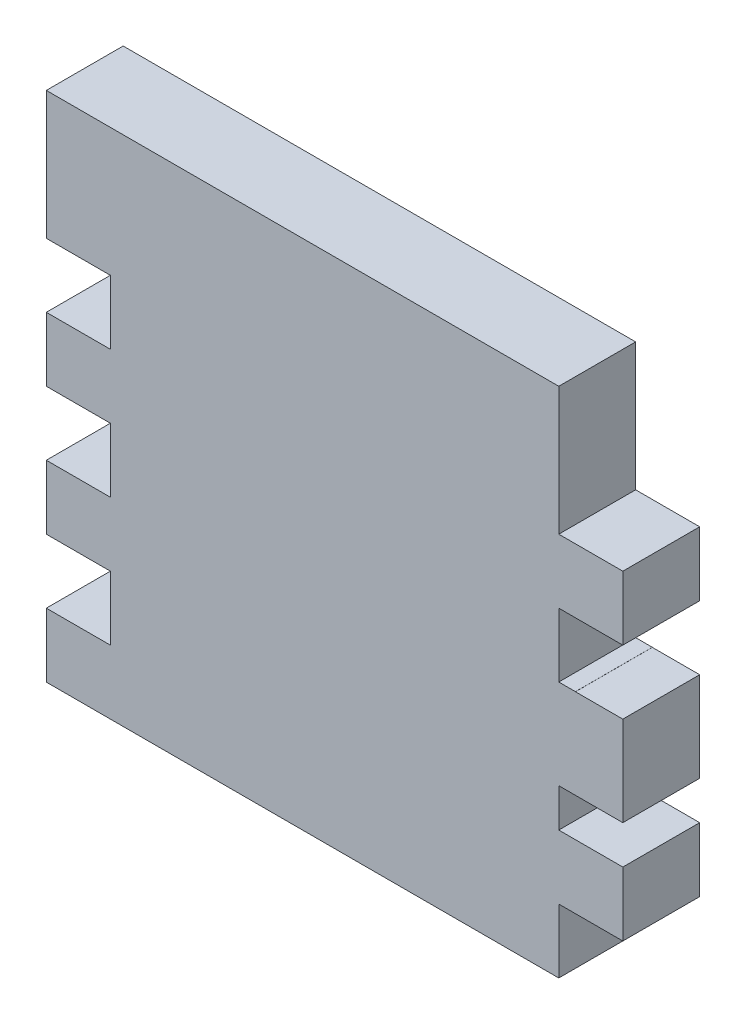
ISO-10303-21;
HEADER;
FILE_DESCRIPTION(('STEP AP214'),'2;1');
FILE_NAME('part.step','',(''),(''),'','','');
FILE_SCHEMA(('AUTOMOTIVE_DESIGN { 1 0 10303 214 1 1 1 1 }'));
ENDSEC;
DATA;
#1=APPLICATION_CONTEXT('core data for automotive mechanical design processes');
#2=APPLICATION_PROTOCOL_DEFINITION('international standard','automotive_design',2000,#1);
#3=PRODUCT_CONTEXT('',#1,'mechanical');
#4=PRODUCT('Part','Part','',(#3));
#5=PRODUCT_RELATED_PRODUCT_CATEGORY('part','',(#4));
#6=PRODUCT_DEFINITION_FORMATION('','',#4);
#7=PRODUCT_DEFINITION_CONTEXT('part definition',#1,'design');
#8=PRODUCT_DEFINITION('design','',#6,#7);
#9=PRODUCT_DEFINITION_SHAPE('','',#8);
#10=(LENGTH_UNIT() NAMED_UNIT(*) SI_UNIT(.MILLI.,.METRE.));
#11=(NAMED_UNIT(*) PLANE_ANGLE_UNIT() SI_UNIT($,.RADIAN.));
#12=(NAMED_UNIT(*) SI_UNIT($,.STERADIAN.) SOLID_ANGLE_UNIT());
#13=UNCERTAINTY_MEASURE_WITH_UNIT(LENGTH_MEASURE(1.E-05),#10,'distance_accuracy_value','');
#14=(GEOMETRIC_REPRESENTATION_CONTEXT(3) GLOBAL_UNCERTAINTY_ASSIGNED_CONTEXT((#13)) GLOBAL_UNIT_ASSIGNED_CONTEXT((#10,
#11,#12)) REPRESENTATION_CONTEXT('',''));
#15=CARTESIAN_POINT('',(0.,0.,0.));
#16=DIRECTION('',(0.,0.,1.));
#17=DIRECTION('',(1.,0.,0.));
#18=AXIS2_PLACEMENT_3D('',#15,#16,#17);
#19=CARTESIAN_POINT('',(0.,0.,6.));
#20=DIRECTION('',(0.,0.,1.));
#21=DIRECTION('',(1.,0.,0.));
#22=AXIS2_PLACEMENT_3D('',#19,#20,#21);
#23=PLANE('',#22);
#24=DIRECTION('',(-1.,0.,0.));
#25=VECTOR('',#24,1.);
#26=CARTESIAN_POINT('',(0.,-4.08616140427002,6.));
#27=LINE('',#26,#25);
#28=CARTESIAN_POINT('',(30.5873162558163,-4.08616140427001,6.));
#29=VERTEX_POINT('',#28);
#30=CARTESIAN_POINT('',(25.5873162558163,-4.08616140427002,6.));
#31=VERTEX_POINT('',#30);
#32=EDGE_CURVE('E367',#29,#31,#27,.T.);
#33=ORIENTED_EDGE('',*,*,#32,.T.);
#34=DIRECTION('',(0.,1.,0.));
#35=VECTOR('',#34,1.);
#36=CARTESIAN_POINT('',(25.5873162558163,-4.08616140427002,6.));
#37=LINE('',#36,#35);
#38=CARTESIAN_POINT('',(25.5873162558163,5.91383859572999,6.));
#39=VERTEX_POINT('',#38);
#40=EDGE_CURVE('E248',#31,#39,#37,.T.);
#41=ORIENTED_EDGE('',*,*,#40,.T.);
#42=DIRECTION('',(-1.,0.,0.));
#43=VECTOR('',#42,1.);
#44=CARTESIAN_POINT('',(-14.4126837441837,5.91383859572999,6.));
#45=LINE('',#44,#43);
#46=CARTESIAN_POINT('',(-14.4126837441837,5.91383859572999,6.));
#47=VERTEX_POINT('',#46);
#48=EDGE_CURVE('E256',#39,#47,#45,.T.);
#49=ORIENTED_EDGE('',*,*,#48,.T.);
#50=DIRECTION('',(0.,-1.,0.));
#51=VECTOR('',#50,1.);
#52=CARTESIAN_POINT('',(-14.4126837441837,5.91383859572999,6.));
#53=LINE('',#52,#51);
#54=CARTESIAN_POINT('',(-14.4126837441837,-4.08616140427001,6.));
#55=VERTEX_POINT('',#54);
#56=EDGE_CURVE('E272',#47,#55,#53,.T.);
#57=ORIENTED_EDGE('',*,*,#56,.T.);
#58=DIRECTION('',(1.,0.,0.));
#59=VECTOR('',#58,1.);
#60=CARTESIAN_POINT('',(0.,-4.08616140427001,6.));
#61=LINE('',#60,#59);
#62=CARTESIAN_POINT('',(-9.41268374418374,-4.08616140427001,6.));
#63=VERTEX_POINT('',#62);
#64=EDGE_CURVE('E341',#55,#63,#61,.T.);
#65=ORIENTED_EDGE('',*,*,#64,.T.);
#66=DIRECTION('',(0.,-1.,0.));
#67=VECTOR('',#66,1.);
#68=CARTESIAN_POINT('',(-9.41268374418374,0.,6.));
#69=LINE('',#68,#67);
#70=CARTESIAN_POINT('',(-9.41268374418374,-9.08616140427001,6.));
#71=VERTEX_POINT('',#70);
#72=EDGE_CURVE('E345',#63,#71,#69,.T.);
#73=ORIENTED_EDGE('',*,*,#72,.T.);
#74=DIRECTION('',(1.,0.,0.));
#75=VECTOR('',#74,1.);
#76=CARTESIAN_POINT('',(0.,-9.08616140427002,6.));
#77=LINE('',#76,#75);
#78=CARTESIAN_POINT('',(-14.4126837441837,-9.08616140427001,6.));
#79=VERTEX_POINT('',#78);
#80=EDGE_CURVE('E336',#79,#71,#77,.T.);
#81=ORIENTED_EDGE('',*,*,#80,.F.);
#82=CARTESIAN_POINT('',(-14.4126837441837,-14.08616140427,6.));
#83=VERTEX_POINT('',#82);
#84=EDGE_CURVE('E322',#79,#83,#53,.T.);
#85=ORIENTED_EDGE('',*,*,#84,.T.);
#86=DIRECTION('',(1.,0.,0.));
#87=VECTOR('',#86,1.);
#88=CARTESIAN_POINT('',(0.,-14.08616140427,6.));
#89=LINE('',#88,#87);
#90=CARTESIAN_POINT('',(-9.41268374418374,-14.08616140427,6.));
#91=VERTEX_POINT('',#90);
#92=EDGE_CURVE('E450',#83,#91,#89,.T.);
#93=ORIENTED_EDGE('',*,*,#92,.T.);
#94=DIRECTION('',(0.,-1.,0.));
#95=VECTOR('',#94,1.);
#96=CARTESIAN_POINT('',(-9.41268374418374,0.,6.));
#97=LINE('',#96,#95);
#98=CARTESIAN_POINT('',(-9.41268374418374,-19.08616140427,6.));
#99=VERTEX_POINT('',#98);
#100=EDGE_CURVE('E412',#91,#99,#97,.T.);
#101=ORIENTED_EDGE('',*,*,#100,.T.);
#102=DIRECTION('',(1.,0.,0.));
#103=VECTOR('',#102,1.);
#104=CARTESIAN_POINT('',(0.,-19.08616140427,6.));
#105=LINE('',#104,#103);
#106=CARTESIAN_POINT('',(-14.4126837441837,-19.08616140427,6.));
#107=VERTEX_POINT('',#106);
#108=EDGE_CURVE('E445',#107,#99,#105,.T.);
#109=ORIENTED_EDGE('',*,*,#108,.F.);
#110=CARTESIAN_POINT('',(-14.4126837441837,-24.08616140427,6.));
#111=VERTEX_POINT('',#110);
#112=EDGE_CURVE('E270',#107,#111,#53,.T.);
#113=ORIENTED_EDGE('',*,*,#112,.T.);
#114=DIRECTION('',(1.,0.,0.));
#115=VECTOR('',#114,1.);
#116=CARTESIAN_POINT('',(0.,-24.08616140427,6.));
#117=LINE('',#116,#115);
#118=CARTESIAN_POINT('',(-9.41268374418374,-24.08616140427,6.));
#119=VERTEX_POINT('',#118);
#120=EDGE_CURVE('E418',#111,#119,#117,.T.);
#121=ORIENTED_EDGE('',*,*,#120,.T.);
#122=DIRECTION('',(0.,-1.,0.));
#123=VECTOR('',#122,1.);
#124=CARTESIAN_POINT('',(-9.41268374418376,0.,6.));
#125=LINE('',#124,#123);
#126=CARTESIAN_POINT('',(-9.41268374418374,-29.08616140427,6.));
#127=VERTEX_POINT('',#126);
#128=EDGE_CURVE('E393',#119,#127,#125,.T.);
#129=ORIENTED_EDGE('',*,*,#128,.T.);
#130=DIRECTION('',(1.,0.,0.));
#131=VECTOR('',#130,1.);
#132=CARTESIAN_POINT('',(0.,-29.08616140427,6.));
#133=LINE('',#132,#131);
#134=CARTESIAN_POINT('',(-14.4126837441837,-29.08616140427,6.));
#135=VERTEX_POINT('',#134);
#136=EDGE_CURVE('E413',#135,#127,#133,.T.);
#137=ORIENTED_EDGE('',*,*,#136,.F.);
#138=CARTESIAN_POINT('',(-14.4126837441837,-34.08616140427,6.));
#139=VERTEX_POINT('',#138);
#140=EDGE_CURVE('E265',#135,#139,#53,.T.);
#141=ORIENTED_EDGE('',*,*,#140,.T.);
#142=DIRECTION('',(1.,0.,0.));
#143=VECTOR('',#142,1.);
#144=CARTESIAN_POINT('',(-14.4126837441837,-34.08616140427,6.));
#145=LINE('',#144,#143);
#146=CARTESIAN_POINT('',(25.5873162558162,-34.08616140427,6.));
#147=VERTEX_POINT('',#146);
#148=EDGE_CURVE('E290',#139,#147,#145,.T.);
#149=ORIENTED_EDGE('',*,*,#148,.T.);
#150=DIRECTION('',(0.,1.,0.));
#151=VECTOR('',#150,1.);
#152=CARTESIAN_POINT('',(25.5873162558163,-34.08616140427,6.));
#153=LINE('',#152,#151);
#154=CARTESIAN_POINT('',(25.5873162558163,-29.08616140427,6.));
#155=VERTEX_POINT('',#154);
#156=EDGE_CURVE('E54',#147,#155,#153,.T.);
#157=ORIENTED_EDGE('',*,*,#156,.T.);
#158=DIRECTION('',(-1.,0.,0.));
#159=VECTOR('',#158,1.);
#160=CARTESIAN_POINT('',(30.5873162558163,-29.08616140427,6.));
#161=LINE('',#160,#159);
#162=CARTESIAN_POINT('',(30.5873162558163,-29.08616140427,6.));
#163=VERTEX_POINT('',#162);
#164=EDGE_CURVE('E495',#163,#155,#161,.T.);
#165=ORIENTED_EDGE('',*,*,#164,.F.);
#166=DIRECTION('',(0.,1.,0.));
#167=VECTOR('',#166,1.);
#168=CARTESIAN_POINT('',(30.5873162558163,5.91383859572999,6.));
#169=LINE('',#168,#167);
#170=CARTESIAN_POINT('',(30.5873162558163,-24.08616140427,6.));
#171=VERTEX_POINT('',#170);
#172=EDGE_CURVE('E313',#163,#171,#169,.T.);
#173=ORIENTED_EDGE('',*,*,#172,.T.);
#174=DIRECTION('',(-1.,0.,0.));
#175=VECTOR('',#174,1.);
#176=CARTESIAN_POINT('',(0.,-24.08616140427,6.));
#177=LINE('',#176,#175);
#178=CARTESIAN_POINT('',(25.5873162558163,-24.08616140427,6.));
#179=VERTEX_POINT('',#178);
#180=EDGE_CURVE('E476',#171,#179,#177,.T.);
#181=ORIENTED_EDGE('',*,*,#180,.T.);
#182=DIRECTION('',(0.,-1.,0.));
#183=VECTOR('',#182,1.);
#184=CARTESIAN_POINT('',(25.5873162558163,-21.08616140427,6.));
#185=LINE('',#184,#183);
#186=CARTESIAN_POINT('',(25.5873162558163,-21.08616140427,6.));
#187=VERTEX_POINT('',#186);
#188=EDGE_CURVE('E507',#187,#179,#185,.T.);
#189=ORIENTED_EDGE('',*,*,#188,.F.);
#190=DIRECTION('',(-1.,0.,0.));
#191=VECTOR('',#190,1.);
#192=CARTESIAN_POINT('',(0.,-21.08616140427,6.));
#193=LINE('',#192,#191);
#194=CARTESIAN_POINT('',(30.5873162558163,-21.08616140427,6.));
#195=VERTEX_POINT('',#194);
#196=EDGE_CURVE('E472',#195,#187,#193,.T.);
#197=ORIENTED_EDGE('',*,*,#196,.F.);
#198=CARTESIAN_POINT('',(30.5873162558163,-14.08616140427,6.));
#199=VERTEX_POINT('',#198);
#200=EDGE_CURVE('E316',#195,#199,#169,.T.);
#201=ORIENTED_EDGE('',*,*,#200,.T.);
#202=DIRECTION('',(-1.,0.,0.));
#203=VECTOR('',#202,1.);
#204=CARTESIAN_POINT('',(0.,-14.08616140427,6.));
#205=LINE('',#204,#203);
#206=CARTESIAN_POINT('',(26.8890700548847,-14.08616140427,6.));
#207=VERTEX_POINT('',#206);
#208=EDGE_CURVE('E372',#199,#207,#205,.T.);
#209=ORIENTED_EDGE('',*,*,#208,.T.);
#210=DIRECTION('',(0.,1.,0.));
#211=VECTOR('',#210,1.);
#212=CARTESIAN_POINT('',(26.8890700548847,0.,6.));
#213=LINE('',#212,#211);
#214=CARTESIAN_POINT('',(26.8890700548847,-14.0789721387085,6.));
#215=VERTEX_POINT('',#214);
#216=EDGE_CURVE('E376',#207,#215,#213,.T.);
#217=ORIENTED_EDGE('',*,*,#216,.T.);
#218=DIRECTION('',(-1.,0.,0.));
#219=VECTOR('',#218,1.);
#220=CARTESIAN_POINT('',(30.5873162558163,-14.0789721387085,6.));
#221=LINE('',#220,#219);
#222=CARTESIAN_POINT('',(25.5873162558163,-14.0789721387085,6.));
#223=VERTEX_POINT('',#222);
#224=EDGE_CURVE('E529',#215,#223,#221,.T.);
#225=ORIENTED_EDGE('',*,*,#224,.T.);
#226=DIRECTION('',(0.,-1.,0.));
#227=VECTOR('',#226,1.);
#228=CARTESIAN_POINT('',(25.5873162558163,-9.08616140427002,6.));
#229=LINE('',#228,#227);
#230=CARTESIAN_POINT('',(25.5873162558163,-9.08616140427002,6.));
#231=VERTEX_POINT('',#230);
#232=EDGE_CURVE('E523',#231,#223,#229,.T.);
#233=ORIENTED_EDGE('',*,*,#232,.F.);
#234=DIRECTION('',(-1.,0.,0.));
#235=VECTOR('',#234,1.);
#236=CARTESIAN_POINT('',(0.,-9.08616140427002,6.));
#237=LINE('',#236,#235);
#238=CARTESIAN_POINT('',(30.5873162558163,-9.08616140427002,6.));
#239=VERTEX_POINT('',#238);
#240=EDGE_CURVE('E368',#239,#231,#237,.T.);
#241=ORIENTED_EDGE('',*,*,#240,.F.);
#242=EDGE_CURVE('E317',#239,#29,#169,.T.);
#243=ORIENTED_EDGE('',*,*,#242,.T.);
#244=EDGE_LOOP('',(#33,#41,#49,#57,#65,#73,#81,#85,#93,#101,#109,#113,#121,#129,#137,#141,#149,
#157,#165,#173,#181,#189,#197,#201,#209,#217,#225,#233,#241,#243));
#245=FACE_BOUND('',#244,.T.);
#246=ADVANCED_FACE('F38',(#245),#23,.T.);
#247=CARTESIAN_POINT('',(0.,0.,0.));
#248=DIRECTION('',(0.,0.,1.));
#249=DIRECTION('',(1.,0.,0.));
#250=AXIS2_PLACEMENT_3D('',#247,#248,#249);
#251=PLANE('',#250);
#252=DIRECTION('',(0.,1.,0.));
#253=VECTOR('',#252,1.);
#254=CARTESIAN_POINT('',(25.5873162558163,-4.08616140427002,0.));
#255=LINE('',#254,#253);
#256=CARTESIAN_POINT('',(25.5873162558163,-4.08616140427002,0.));
#257=VERTEX_POINT('',#256);
#258=CARTESIAN_POINT('',(25.5873162558163,5.91383859572999,0.));
#259=VERTEX_POINT('',#258);
#260=EDGE_CURVE('E236',#257,#259,#255,.T.);
#261=ORIENTED_EDGE('',*,*,#260,.F.);
#262=DIRECTION('',(-1.,0.,0.));
#263=VECTOR('',#262,1.);
#264=CARTESIAN_POINT('',(0.,-4.08616140427002,0.));
#265=LINE('',#264,#263);
#266=CARTESIAN_POINT('',(30.5873162558163,-4.08616140427001,0.));
#267=VERTEX_POINT('',#266);
#268=EDGE_CURVE('E394',#267,#257,#265,.T.);
#269=ORIENTED_EDGE('',*,*,#268,.F.);
#270=DIRECTION('',(0.,1.,0.));
#271=VECTOR('',#270,1.);
#272=CARTESIAN_POINT('',(30.5873162558163,5.91383859572999,0.));
#273=LINE('',#272,#271);
#274=CARTESIAN_POINT('',(30.5873162558163,-9.08616140427002,0.));
#275=VERTEX_POINT('',#274);
#276=EDGE_CURVE('E275',#275,#267,#273,.T.);
#277=ORIENTED_EDGE('',*,*,#276,.F.);
#278=DIRECTION('',(-1.,0.,0.));
#279=VECTOR('',#278,1.);
#280=CARTESIAN_POINT('',(0.,-9.08616140427002,0.));
#281=LINE('',#280,#279);
#282=CARTESIAN_POINT('',(25.5873162558163,-9.08616140427002,0.));
#283=VERTEX_POINT('',#282);
#284=EDGE_CURVE('E361',#275,#283,#281,.T.);
#285=ORIENTED_EDGE('',*,*,#284,.T.);
#286=DIRECTION('',(0.,-1.,0.));
#287=VECTOR('',#286,1.);
#288=CARTESIAN_POINT('',(25.5873162558163,-9.08616140427002,0.));
#289=LINE('',#288,#287);
#290=CARTESIAN_POINT('',(25.5873162558163,-14.0789721387085,0.));
#291=VERTEX_POINT('',#290);
#292=EDGE_CURVE('E524',#283,#291,#289,.T.);
#293=ORIENTED_EDGE('',*,*,#292,.T.);
#294=DIRECTION('',(-1.,0.,0.));
#295=VECTOR('',#294,1.);
#296=CARTESIAN_POINT('',(30.5873162558163,-14.0789721387085,0.));
#297=LINE('',#296,#295);
#298=CARTESIAN_POINT('',(26.8890700548847,-14.0789721387085,0.));
#299=VERTEX_POINT('',#298);
#300=EDGE_CURVE('E520',#299,#291,#297,.T.);
#301=ORIENTED_EDGE('',*,*,#300,.F.);
#302=DIRECTION('',(0.,1.,0.));
#303=VECTOR('',#302,1.);
#304=CARTESIAN_POINT('',(26.8890700548847,0.,0.));
#305=LINE('',#304,#303);
#306=CARTESIAN_POINT('',(26.8890700548847,-14.08616140427,0.));
#307=VERTEX_POINT('',#306);
#308=EDGE_CURVE('E371',#307,#299,#305,.T.);
#309=ORIENTED_EDGE('',*,*,#308,.F.);
#310=DIRECTION('',(-1.,0.,0.));
#311=VECTOR('',#310,1.);
#312=CARTESIAN_POINT('',(0.,-14.08616140427,0.));
#313=LINE('',#312,#311);
#314=CARTESIAN_POINT('',(30.5873162558163,-14.08616140427,0.));
#315=VERTEX_POINT('',#314);
#316=EDGE_CURVE('E383',#315,#307,#313,.T.);
#317=ORIENTED_EDGE('',*,*,#316,.F.);
#318=CARTESIAN_POINT('',(30.5873162558163,-21.08616140427,0.));
#319=VERTEX_POINT('',#318);
#320=EDGE_CURVE('E273',#319,#315,#273,.T.);
#321=ORIENTED_EDGE('',*,*,#320,.F.);
#322=DIRECTION('',(-1.,0.,0.));
#323=VECTOR('',#322,1.);
#324=CARTESIAN_POINT('',(0.,-21.08616140427,0.));
#325=LINE('',#324,#323);
#326=CARTESIAN_POINT('',(25.5873162558163,-21.08616140427,0.));
#327=VERTEX_POINT('',#326);
#328=EDGE_CURVE('E469',#319,#327,#325,.T.);
#329=ORIENTED_EDGE('',*,*,#328,.T.);
#330=DIRECTION('',(0.,-1.,0.));
#331=VECTOR('',#330,1.);
#332=CARTESIAN_POINT('',(25.5873162558163,-21.08616140427,0.));
#333=LINE('',#332,#331);
#334=CARTESIAN_POINT('',(25.5873162558163,-24.08616140427,0.));
#335=VERTEX_POINT('',#334);
#336=EDGE_CURVE('E503',#327,#335,#333,.T.);
#337=ORIENTED_EDGE('',*,*,#336,.T.);
#338=DIRECTION('',(-1.,0.,0.));
#339=VECTOR('',#338,1.);
#340=CARTESIAN_POINT('',(0.,-24.08616140427,0.));
#341=LINE('',#340,#339);
#342=CARTESIAN_POINT('',(30.5873162558163,-24.08616140427,0.));
#343=VERTEX_POINT('',#342);
#344=EDGE_CURVE('E475',#343,#335,#341,.T.);
#345=ORIENTED_EDGE('',*,*,#344,.F.);
#346=CARTESIAN_POINT('',(30.5873162558163,-29.08616140427,0.));
#347=VERTEX_POINT('',#346);
#348=EDGE_CURVE('E266',#347,#343,#273,.T.);
#349=ORIENTED_EDGE('',*,*,#348,.F.);
#350=DIRECTION('',(-1.,0.,0.));
#351=VECTOR('',#350,1.);
#352=CARTESIAN_POINT('',(30.5873162558163,-29.08616140427,0.));
#353=LINE('',#352,#351);
#354=CARTESIAN_POINT('',(25.5873162558163,-29.08616140427,0.));
#355=VERTEX_POINT('',#354);
#356=EDGE_CURVE('E494',#347,#355,#353,.T.);
#357=ORIENTED_EDGE('',*,*,#356,.T.);
#358=DIRECTION('',(0.,1.,0.));
#359=VECTOR('',#358,1.);
#360=CARTESIAN_POINT('',(25.5873162558163,-34.08616140427,0.));
#361=LINE('',#360,#359);
#362=CARTESIAN_POINT('',(25.5873162558163,-34.08616140427,0.));
#363=VERTEX_POINT('',#362);
#364=EDGE_CURVE('E304',#363,#355,#361,.T.);
#365=ORIENTED_EDGE('',*,*,#364,.F.);
#366=DIRECTION('',(1.,0.,0.));
#367=VECTOR('',#366,1.);
#368=CARTESIAN_POINT('',(-14.4126837441837,-34.08616140427,0.));
#369=LINE('',#368,#367);
#370=CARTESIAN_POINT('',(-14.4126837441837,-34.08616140427,0.));
#371=VERTEX_POINT('',#370);
#372=EDGE_CURVE('E288',#371,#363,#369,.T.);
#373=ORIENTED_EDGE('',*,*,#372,.F.);
#374=DIRECTION('',(0.,-1.,0.));
#375=VECTOR('',#374,1.);
#376=CARTESIAN_POINT('',(-14.4126837441837,5.91383859572999,0.));
#377=LINE('',#376,#375);
#378=CARTESIAN_POINT('',(-14.4126837441837,-29.08616140427,0.));
#379=VERTEX_POINT('',#378);
#380=EDGE_CURVE('E295',#379,#371,#377,.T.);
#381=ORIENTED_EDGE('',*,*,#380,.F.);
#382=DIRECTION('',(1.,0.,0.));
#383=VECTOR('',#382,1.);
#384=CARTESIAN_POINT('',(0.,-29.08616140427,0.));
#385=LINE('',#384,#383);
#386=CARTESIAN_POINT('',(-9.41268374418374,-29.08616140427,0.));
#387=VERTEX_POINT('',#386);
#388=EDGE_CURVE('E403',#379,#387,#385,.T.);
#389=ORIENTED_EDGE('',*,*,#388,.T.);
#390=DIRECTION('',(0.,-1.,0.));
#391=VECTOR('',#390,1.);
#392=CARTESIAN_POINT('',(-9.41268374418376,0.,0.));
#393=LINE('',#392,#391);
#394=CARTESIAN_POINT('',(-9.41268374418374,-24.08616140427,0.));
#395=VERTEX_POINT('',#394);
#396=EDGE_CURVE('E417',#395,#387,#393,.T.);
#397=ORIENTED_EDGE('',*,*,#396,.F.);
#398=DIRECTION('',(1.,0.,0.));
#399=VECTOR('',#398,1.);
#400=CARTESIAN_POINT('',(0.,-24.08616140427,0.));
#401=LINE('',#400,#399);
#402=CARTESIAN_POINT('',(-14.4126837441837,-24.08616140427,0.));
#403=VERTEX_POINT('',#402);
#404=EDGE_CURVE('E427',#403,#395,#401,.T.);
#405=ORIENTED_EDGE('',*,*,#404,.F.);
#406=CARTESIAN_POINT('',(-14.4126837441837,-19.08616140427,0.));
#407=VERTEX_POINT('',#406);
#408=EDGE_CURVE('E299',#407,#403,#377,.T.);
#409=ORIENTED_EDGE('',*,*,#408,.F.);
#410=DIRECTION('',(1.,0.,0.));
#411=VECTOR('',#410,1.);
#412=CARTESIAN_POINT('',(0.,-19.08616140427,0.));
#413=LINE('',#412,#411);
#414=CARTESIAN_POINT('',(-9.41268374418374,-19.08616140427,0.));
#415=VERTEX_POINT('',#414);
#416=EDGE_CURVE('E436',#407,#415,#413,.T.);
#417=ORIENTED_EDGE('',*,*,#416,.T.);
#418=DIRECTION('',(0.,-1.,0.));
#419=VECTOR('',#418,1.);
#420=CARTESIAN_POINT('',(-9.41268374418374,0.,0.));
#421=LINE('',#420,#419);
#422=CARTESIAN_POINT('',(-9.41268374418374,-14.08616140427,0.));
#423=VERTEX_POINT('',#422);
#424=EDGE_CURVE('E449',#423,#415,#421,.T.);
#425=ORIENTED_EDGE('',*,*,#424,.F.);
#426=DIRECTION('',(1.,0.,0.));
#427=VECTOR('',#426,1.);
#428=CARTESIAN_POINT('',(0.,-14.08616140427,0.));
#429=LINE('',#428,#427);
#430=CARTESIAN_POINT('',(-14.4126837441837,-14.08616140427,0.));
#431=VERTEX_POINT('',#430);
#432=EDGE_CURVE('E460',#431,#423,#429,.T.);
#433=ORIENTED_EDGE('',*,*,#432,.F.);
#434=CARTESIAN_POINT('',(-14.4126837441837,-9.08616140427001,0.));
#435=VERTEX_POINT('',#434);
#436=EDGE_CURVE('E309',#435,#431,#377,.T.);
#437=ORIENTED_EDGE('',*,*,#436,.F.);
#438=DIRECTION('',(1.,0.,0.));
#439=VECTOR('',#438,1.);
#440=CARTESIAN_POINT('',(0.,-9.08616140427002,0.));
#441=LINE('',#440,#439);
#442=CARTESIAN_POINT('',(-9.41268374418374,-9.08616140427001,0.));
#443=VERTEX_POINT('',#442);
#444=EDGE_CURVE('E327',#435,#443,#441,.T.);
#445=ORIENTED_EDGE('',*,*,#444,.T.);
#446=DIRECTION('',(0.,-1.,0.));
#447=VECTOR('',#446,1.);
#448=CARTESIAN_POINT('',(-9.41268374418374,0.,0.));
#449=LINE('',#448,#447);
#450=CARTESIAN_POINT('',(-9.41268374418374,-4.08616140427001,0.));
#451=VERTEX_POINT('',#450);
#452=EDGE_CURVE('E340',#451,#443,#449,.T.);
#453=ORIENTED_EDGE('',*,*,#452,.F.);
#454=DIRECTION('',(1.,0.,0.));
#455=VECTOR('',#454,1.);
#456=CARTESIAN_POINT('',(0.,-4.08616140427001,0.));
#457=LINE('',#456,#455);
#458=CARTESIAN_POINT('',(-14.4126837441837,-4.08616140427001,0.));
#459=VERTEX_POINT('',#458);
#460=EDGE_CURVE('E353',#459,#451,#457,.T.);
#461=ORIENTED_EDGE('',*,*,#460,.F.);
#462=CARTESIAN_POINT('',(-14.4126837441837,5.91383859572999,0.));
#463=VERTEX_POINT('',#462);
#464=EDGE_CURVE('E263',#463,#459,#377,.T.);
#465=ORIENTED_EDGE('',*,*,#464,.F.);
#466=DIRECTION('',(-1.,0.,0.));
#467=VECTOR('',#466,1.);
#468=CARTESIAN_POINT('',(-14.4126837441837,5.91383859572999,0.));
#469=LINE('',#468,#467);
#470=EDGE_CURVE('E254',#259,#463,#469,.T.);
#471=ORIENTED_EDGE('',*,*,#470,.F.);
#472=EDGE_LOOP('',(#261,#269,#277,#285,#293,#301,#309,#317,#321,#329,#337,#345,#349,#357,#365,
#373,#381,#389,#397,#405,#409,#417,#425,#433,#437,#445,#453,#461,#465,#471));
#473=FACE_BOUND('',#472,.T.);
#474=ADVANCED_FACE('F260',(#473),#251,.F.);
#475=CARTESIAN_POINT('',(-14.4126837441837,5.91383859572999,6.));
#476=DIRECTION('',(0.,-1.,0.));
#477=DIRECTION('',(0.,0.,-1.));
#478=AXIS2_PLACEMENT_3D('',#475,#476,#477);
#479=PLANE('',#478);
#480=DIRECTION('',(0.,0.,1.));
#481=VECTOR('',#480,1.);
#482=CARTESIAN_POINT('',(25.5873162558163,5.91383859572999,0.));
#483=LINE('',#482,#481);
#484=EDGE_CURVE('E240',#259,#39,#483,.T.);
#485=ORIENTED_EDGE('',*,*,#484,.F.);
#486=ORIENTED_EDGE('',*,*,#470,.T.);
#487=DIRECTION('',(0.,0.,-1.));
#488=VECTOR('',#487,1.);
#489=CARTESIAN_POINT('',(-14.4126837441837,5.91383859572999,6.));
#490=LINE('',#489,#488);
#491=EDGE_CURVE('E278',#47,#463,#490,.T.);
#492=ORIENTED_EDGE('',*,*,#491,.F.);
#493=ORIENTED_EDGE('',*,*,#48,.F.);
#494=EDGE_LOOP('',(#485,#486,#492,#493));
#495=FACE_BOUND('',#494,.T.);
#496=ADVANCED_FACE('F252',(#495),#479,.F.);
#497=CARTESIAN_POINT('',(26.8890700548847,0.,0.));
#498=DIRECTION('',(1.,0.,0.));
#499=DIRECTION('',(0.,1.,0.));
#500=AXIS2_PLACEMENT_3D('',#497,#498,#499);
#501=PLANE('',#500);
#502=ORIENTED_EDGE('',*,*,#308,.T.);
#503=DIRECTION('',(0.,0.,1.));
#504=VECTOR('',#503,1.);
#505=CARTESIAN_POINT('',(26.8890700548847,-14.0789721387085,0.));
#506=LINE('',#505,#504);
#507=EDGE_CURVE('E11',#299,#215,#506,.T.);
#508=ORIENTED_EDGE('',*,*,#507,.T.);
#509=ORIENTED_EDGE('',*,*,#216,.F.);
#510=DIRECTION('',(0.,0.,1.));
#511=VECTOR('',#510,1.);
#512=CARTESIAN_POINT('',(26.8890700548847,-14.08616140427,0.));
#513=LINE('',#512,#511);
#514=EDGE_CURVE('E358',#307,#207,#513,.T.);
#515=ORIENTED_EDGE('',*,*,#514,.F.);
#516=EDGE_LOOP('',(#502,#508,#509,#515));
#517=FACE_BOUND('',#516,.T.);
#518=ADVANCED_FACE('F567',(#517),#501,.T.);
#519=CARTESIAN_POINT('',(-14.4126837441837,-34.08616140427,6.));
#520=DIRECTION('',(0.,1.,0.));
#521=DIRECTION('',(0.,0.,1.));
#522=AXIS2_PLACEMENT_3D('',#519,#520,#521);
#523=PLANE('',#522);
#524=DIRECTION('',(0.,0.,1.));
#525=VECTOR('',#524,1.);
#526=CARTESIAN_POINT('',(25.5873162558163,-34.08616140427,0.));
#527=LINE('',#526,#525);
#528=EDGE_CURVE('E487',#363,#147,#527,.T.);
#529=ORIENTED_EDGE('',*,*,#528,.T.);
#530=ORIENTED_EDGE('',*,*,#148,.F.);
#531=DIRECTION('',(0.,0.,-1.));
#532=VECTOR('',#531,1.);
#533=CARTESIAN_POINT('',(-14.4126837441837,-34.08616140427,6.));
#534=LINE('',#533,#532);
#535=EDGE_CURVE('E47',#139,#371,#534,.T.);
#536=ORIENTED_EDGE('',*,*,#535,.T.);
#537=ORIENTED_EDGE('',*,*,#372,.T.);
#538=EDGE_LOOP('',(#529,#530,#536,#537));
#539=FACE_BOUND('',#538,.T.);
#540=ADVANCED_FACE('F286',(#539),#523,.F.);
#541=CARTESIAN_POINT('',(-14.4126837441837,5.91383859572999,6.));
#542=DIRECTION('',(1.,0.,0.));
#543=DIRECTION('',(0.,1.,0.));
#544=AXIS2_PLACEMENT_3D('',#541,#542,#543);
#545=PLANE('',#544);
#546=DIRECTION('',(0.,0.,1.));
#547=VECTOR('',#546,1.);
#548=CARTESIAN_POINT('',(-14.4126837441837,-14.08616140427,0.));
#549=LINE('',#548,#547);
#550=EDGE_CURVE('E435',#431,#83,#549,.T.);
#551=ORIENTED_EDGE('',*,*,#550,.T.);
#552=ORIENTED_EDGE('',*,*,#84,.F.);
#553=DIRECTION('',(0.,0.,1.));
#554=VECTOR('',#553,1.);
#555=CARTESIAN_POINT('',(-14.4126837441837,-9.08616140427001,0.));
#556=LINE('',#555,#554);
#557=EDGE_CURVE('E331',#435,#79,#556,.T.);
#558=ORIENTED_EDGE('',*,*,#557,.F.);
#559=ORIENTED_EDGE('',*,*,#436,.T.);
#560=EDGE_LOOP('',(#551,#552,#558,#559));
#561=FACE_BOUND('',#560,.T.);
#562=ADVANCED_FACE('F628',(#561),#545,.F.);
#563=ORIENTED_EDGE('',*,*,#112,.F.);
#564=DIRECTION('',(0.,0.,1.));
#565=VECTOR('',#564,1.);
#566=CARTESIAN_POINT('',(-14.4126837441837,-19.08616140427,0.));
#567=LINE('',#566,#565);
#568=EDGE_CURVE('E440',#407,#107,#567,.T.);
#569=ORIENTED_EDGE('',*,*,#568,.F.);
#570=ORIENTED_EDGE('',*,*,#408,.T.);
#571=DIRECTION('',(0.,0.,1.));
#572=VECTOR('',#571,1.);
#573=CARTESIAN_POINT('',(-14.4126837441837,-24.08616140427,0.));
#574=LINE('',#573,#572);
#575=EDGE_CURVE('E402',#403,#111,#574,.T.);
#576=ORIENTED_EDGE('',*,*,#575,.T.);
#577=EDGE_LOOP('',(#563,#569,#570,#576));
#578=FACE_BOUND('',#577,.T.);
#579=ADVANCED_FACE('F618',(#578),#545,.F.);
#580=DIRECTION('',(0.,0.,1.));
#581=VECTOR('',#580,1.);
#582=CARTESIAN_POINT('',(-14.4126837441837,-4.08616140427001,0.));
#583=LINE('',#582,#581);
#584=EDGE_CURVE('E326',#459,#55,#583,.T.);
#585=ORIENTED_EDGE('',*,*,#584,.T.);
#586=ORIENTED_EDGE('',*,*,#56,.F.);
#587=ORIENTED_EDGE('',*,*,#491,.T.);
#588=ORIENTED_EDGE('',*,*,#464,.T.);
#589=EDGE_LOOP('',(#585,#586,#587,#588));
#590=FACE_BOUND('',#589,.T.);
#591=ADVANCED_FACE('F666',(#590),#545,.F.);
#592=CARTESIAN_POINT('',(30.5873162558163,5.91383859572999,6.));
#593=DIRECTION('',(-1.,0.,0.));
#594=DIRECTION('',(0.,0.,1.));
#595=AXIS2_PLACEMENT_3D('',#592,#593,#594);
#596=PLANE('',#595);
#597=DIRECTION('',(0.,0.,1.));
#598=VECTOR('',#597,1.);
#599=CARTESIAN_POINT('',(30.5873162558163,-4.08616140427001,0.));
#600=LINE('',#599,#598);
#601=EDGE_CURVE('E389',#267,#29,#600,.T.);
#602=ORIENTED_EDGE('',*,*,#601,.T.);
#603=ORIENTED_EDGE('',*,*,#242,.F.);
#604=DIRECTION('',(0.,0.,1.));
#605=VECTOR('',#604,1.);
#606=CARTESIAN_POINT('',(30.5873162558163,-9.08616140427002,0.));
#607=LINE('',#606,#605);
#608=EDGE_CURVE('E364',#275,#239,#607,.T.);
#609=ORIENTED_EDGE('',*,*,#608,.F.);
#610=ORIENTED_EDGE('',*,*,#276,.T.);
#611=EDGE_LOOP('',(#602,#603,#609,#610));
#612=FACE_BOUND('',#611,.T.);
#613=ADVANCED_FACE('F553',(#612),#596,.F.);
#614=DIRECTION('',(0.,0.,1.));
#615=VECTOR('',#614,1.);
#616=CARTESIAN_POINT('',(30.5873162558163,-14.08616140427,0.));
#617=LINE('',#616,#615);
#618=EDGE_CURVE('E62',#315,#199,#617,.T.);
#619=ORIENTED_EDGE('',*,*,#618,.T.);
#620=ORIENTED_EDGE('',*,*,#200,.F.);
#621=DIRECTION('',(0.,0.,1.));
#622=VECTOR('',#621,1.);
#623=CARTESIAN_POINT('',(30.5873162558163,-21.08616140427,0.));
#624=LINE('',#623,#622);
#625=EDGE_CURVE('E380',#319,#195,#624,.T.);
#626=ORIENTED_EDGE('',*,*,#625,.F.);
#627=ORIENTED_EDGE('',*,*,#320,.T.);
#628=EDGE_LOOP('',(#619,#620,#626,#627));
#629=FACE_BOUND('',#628,.T.);
#630=ADVANCED_FACE('F574',(#629),#596,.F.);
#631=ORIENTED_EDGE('',*,*,#172,.F.);
#632=DIRECTION('',(0.,0.,1.));
#633=VECTOR('',#632,1.);
#634=CARTESIAN_POINT('',(30.5873162558163,-29.08616140427,0.));
#635=LINE('',#634,#633);
#636=EDGE_CURVE('E479',#347,#163,#635,.T.);
#637=ORIENTED_EDGE('',*,*,#636,.F.);
#638=ORIENTED_EDGE('',*,*,#348,.T.);
#639=DIRECTION('',(0.,0.,1.));
#640=VECTOR('',#639,1.);
#641=CARTESIAN_POINT('',(30.5873162558163,-24.08616140427,0.));
#642=LINE('',#641,#640);
#643=EDGE_CURVE('E465',#343,#171,#642,.T.);
#644=ORIENTED_EDGE('',*,*,#643,.T.);
#645=EDGE_LOOP('',(#631,#637,#638,#644));
#646=FACE_BOUND('',#645,.T.);
#647=ADVANCED_FACE('F595',(#646),#596,.F.);
#648=ORIENTED_EDGE('',*,*,#140,.F.);
#649=DIRECTION('',(0.,0.,1.));
#650=VECTOR('',#649,1.);
#651=CARTESIAN_POINT('',(-14.4126837441837,-29.08616140427,0.));
#652=LINE('',#651,#650);
#653=EDGE_CURVE('E296',#379,#135,#652,.T.);
#654=ORIENTED_EDGE('',*,*,#653,.F.);
#655=ORIENTED_EDGE('',*,*,#380,.T.);
#656=ORIENTED_EDGE('',*,*,#535,.F.);
#657=EDGE_LOOP('',(#648,#654,#655,#656));
#658=FACE_BOUND('',#657,.T.);
#659=ADVANCED_FACE('F40',(#658),#545,.F.);
#660=CARTESIAN_POINT('',(-9.41268374418374,0.,0.));
#661=DIRECTION('',(-1.,0.,0.));
#662=DIRECTION('',(0.,-1.,0.));
#663=AXIS2_PLACEMENT_3D('',#660,#661,#662);
#664=PLANE('',#663);
#665=ORIENTED_EDGE('',*,*,#72,.F.);
#666=DIRECTION('',(0.,0.,1.));
#667=VECTOR('',#666,1.);
#668=CARTESIAN_POINT('',(-9.41268374418374,-4.08616140427001,0.));
#669=LINE('',#668,#667);
#670=EDGE_CURVE('E323',#451,#63,#669,.T.);
#671=ORIENTED_EDGE('',*,*,#670,.F.);
#672=ORIENTED_EDGE('',*,*,#452,.T.);
#673=DIRECTION('',(0.,0.,1.));
#674=VECTOR('',#673,1.);
#675=CARTESIAN_POINT('',(-9.41268374418374,-9.08616140427001,0.));
#676=LINE('',#675,#674);
#677=EDGE_CURVE('E300',#443,#71,#676,.T.);
#678=ORIENTED_EDGE('',*,*,#677,.T.);
#679=EDGE_LOOP('',(#665,#671,#672,#678));
#680=FACE_BOUND('',#679,.T.);
#681=ADVANCED_FACE('F660',(#680),#664,.T.);
#682=CARTESIAN_POINT('',(0.,-9.08616140427002,0.));
#683=DIRECTION('',(0.,-1.,0.));
#684=DIRECTION('',(1.,0.,0.));
#685=AXIS2_PLACEMENT_3D('',#682,#683,#684);
#686=PLANE('',#685);
#687=ORIENTED_EDGE('',*,*,#80,.T.);
#688=ORIENTED_EDGE('',*,*,#677,.F.);
#689=ORIENTED_EDGE('',*,*,#444,.F.);
#690=ORIENTED_EDGE('',*,*,#557,.T.);
#691=EDGE_LOOP('',(#687,#688,#689,#690));
#692=FACE_BOUND('',#691,.T.);
#693=ADVANCED_FACE('F678',(#692),#686,.F.);
#694=CARTESIAN_POINT('',(0.,-4.08616140427001,0.));
#695=DIRECTION('',(0.,-1.,0.));
#696=DIRECTION('',(0.,0.,-1.));
#697=AXIS2_PLACEMENT_3D('',#694,#695,#696);
#698=PLANE('',#697);
#699=ORIENTED_EDGE('',*,*,#64,.F.);
#700=ORIENTED_EDGE('',*,*,#584,.F.);
#701=ORIENTED_EDGE('',*,*,#460,.T.);
#702=ORIENTED_EDGE('',*,*,#670,.T.);
#703=EDGE_LOOP('',(#699,#700,#701,#702));
#704=FACE_BOUND('',#703,.T.);
#705=ADVANCED_FACE('F680',(#704),#698,.T.);
#706=CARTESIAN_POINT('',(0.,-21.08616140427,0.));
#707=DIRECTION('',(0.,1.,0.));
#708=DIRECTION('',(0.,0.,1.));
#709=AXIS2_PLACEMENT_3D('',#706,#707,#708);
#710=PLANE('',#709);
#711=ORIENTED_EDGE('',*,*,#196,.T.);
#712=DIRECTION('',(0.,0.,1.));
#713=VECTOR('',#712,1.);
#714=CARTESIAN_POINT('',(25.5873162558163,-21.08616140427,0.));
#715=LINE('',#714,#713);
#716=EDGE_CURVE('E508',#327,#187,#715,.T.);
#717=ORIENTED_EDGE('',*,*,#716,.F.);
#718=ORIENTED_EDGE('',*,*,#328,.F.);
#719=ORIENTED_EDGE('',*,*,#625,.T.);
#720=EDGE_LOOP('',(#711,#717,#718,#719));
#721=FACE_BOUND('',#720,.T.);
#722=ADVANCED_FACE('F580',(#721),#710,.F.);
#723=CARTESIAN_POINT('',(0.,-24.08616140427,0.));
#724=DIRECTION('',(0.,1.,0.));
#725=DIRECTION('',(0.,0.,1.));
#726=AXIS2_PLACEMENT_3D('',#723,#724,#725);
#727=PLANE('',#726);
#728=ORIENTED_EDGE('',*,*,#180,.F.);
#729=ORIENTED_EDGE('',*,*,#643,.F.);
#730=ORIENTED_EDGE('',*,*,#344,.T.);
#731=DIRECTION('',(0.,0.,1.));
#732=VECTOR('',#731,1.);
#733=CARTESIAN_POINT('',(25.5873162558163,-24.08616140427,0.));
#734=LINE('',#733,#732);
#735=EDGE_CURVE('E516',#335,#179,#734,.T.);
#736=ORIENTED_EDGE('',*,*,#735,.T.);
#737=EDGE_LOOP('',(#728,#729,#730,#736));
#738=FACE_BOUND('',#737,.T.);
#739=ADVANCED_FACE('F592',(#738),#727,.T.);
#740=CARTESIAN_POINT('',(0.,-9.08616140427002,0.));
#741=DIRECTION('',(0.,1.,0.));
#742=DIRECTION('',(0.,0.,1.));
#743=AXIS2_PLACEMENT_3D('',#740,#741,#742);
#744=PLANE('',#743);
#745=ORIENTED_EDGE('',*,*,#240,.T.);
#746=DIRECTION('',(0.,0.,1.));
#747=VECTOR('',#746,1.);
#748=CARTESIAN_POINT('',(25.5873162558163,-9.08616140427002,0.));
#749=LINE('',#748,#747);
#750=EDGE_CURVE('E528',#283,#231,#749,.T.);
#751=ORIENTED_EDGE('',*,*,#750,.F.);
#752=ORIENTED_EDGE('',*,*,#284,.F.);
#753=ORIENTED_EDGE('',*,*,#608,.T.);
#754=EDGE_LOOP('',(#745,#751,#752,#753));
#755=FACE_BOUND('',#754,.T.);
#756=ADVANCED_FACE('F555',(#755),#744,.F.);
#757=CARTESIAN_POINT('',(0.,-14.08616140427,0.));
#758=DIRECTION('',(0.,1.,0.));
#759=DIRECTION('',(0.,0.,1.));
#760=AXIS2_PLACEMENT_3D('',#757,#758,#759);
#761=PLANE('',#760);
#762=ORIENTED_EDGE('',*,*,#208,.F.);
#763=ORIENTED_EDGE('',*,*,#618,.F.);
#764=ORIENTED_EDGE('',*,*,#316,.T.);
#765=ORIENTED_EDGE('',*,*,#514,.T.);
#766=EDGE_LOOP('',(#762,#763,#764,#765));
#767=FACE_BOUND('',#766,.T.);
#768=ADVANCED_FACE('F569',(#767),#761,.T.);
#769=CARTESIAN_POINT('',(0.,-4.08616140427002,0.));
#770=DIRECTION('',(0.,1.,0.));
#771=DIRECTION('',(-1.,0.,0.));
#772=AXIS2_PLACEMENT_3D('',#769,#770,#771);
#773=PLANE('',#772);
#774=ORIENTED_EDGE('',*,*,#32,.F.);
#775=ORIENTED_EDGE('',*,*,#601,.F.);
#776=ORIENTED_EDGE('',*,*,#268,.T.);
#777=DIRECTION('',(0.,0.,1.));
#778=VECTOR('',#777,1.);
#779=CARTESIAN_POINT('',(25.5873162558163,-4.08616140427002,0.));
#780=LINE('',#779,#778);
#781=EDGE_CURVE('E243',#257,#31,#780,.T.);
#782=ORIENTED_EDGE('',*,*,#781,.T.);
#783=EDGE_LOOP('',(#774,#775,#776,#782));
#784=FACE_BOUND('',#783,.T.);
#785=ADVANCED_FACE('F549',(#784),#773,.T.);
#786=CARTESIAN_POINT('',(-9.41268374418376,0.,0.));
#787=DIRECTION('',(-1.,0.,0.));
#788=DIRECTION('',(0.,-1.,0.));
#789=AXIS2_PLACEMENT_3D('',#786,#787,#788);
#790=PLANE('',#789);
#791=ORIENTED_EDGE('',*,*,#128,.F.);
#792=DIRECTION('',(0.,0.,1.));
#793=VECTOR('',#792,1.);
#794=CARTESIAN_POINT('',(-9.41268374418374,-24.08616140427,0.));
#795=LINE('',#794,#793);
#796=EDGE_CURVE('E399',#395,#119,#795,.T.);
#797=ORIENTED_EDGE('',*,*,#796,.F.);
#798=ORIENTED_EDGE('',*,*,#396,.T.);
#799=DIRECTION('',(0.,0.,1.));
#800=VECTOR('',#799,1.);
#801=CARTESIAN_POINT('',(-9.41268374418374,-29.08616140427,0.));
#802=LINE('',#801,#800);
#803=EDGE_CURVE('E409',#387,#127,#802,.T.);
#804=ORIENTED_EDGE('',*,*,#803,.T.);
#805=EDGE_LOOP('',(#791,#797,#798,#804));
#806=FACE_BOUND('',#805,.T.);
#807=ADVANCED_FACE('F612',(#806),#790,.T.);
#808=CARTESIAN_POINT('',(0.,-29.08616140427,0.));
#809=DIRECTION('',(0.,-1.,0.));
#810=DIRECTION('',(1.,0.,0.));
#811=AXIS2_PLACEMENT_3D('',#808,#809,#810);
#812=PLANE('',#811);
#813=ORIENTED_EDGE('',*,*,#136,.T.);
#814=ORIENTED_EDGE('',*,*,#803,.F.);
#815=ORIENTED_EDGE('',*,*,#388,.F.);
#816=ORIENTED_EDGE('',*,*,#653,.T.);
#817=EDGE_LOOP('',(#813,#814,#815,#816));
#818=FACE_BOUND('',#817,.T.);
#819=ADVANCED_FACE('F605',(#818),#812,.F.);
#820=CARTESIAN_POINT('',(0.,-24.08616140427,0.));
#821=DIRECTION('',(0.,-1.,0.));
#822=DIRECTION('',(0.,0.,-1.));
#823=AXIS2_PLACEMENT_3D('',#820,#821,#822);
#824=PLANE('',#823);
#825=ORIENTED_EDGE('',*,*,#120,.F.);
#826=ORIENTED_EDGE('',*,*,#575,.F.);
#827=ORIENTED_EDGE('',*,*,#404,.T.);
#828=ORIENTED_EDGE('',*,*,#796,.T.);
#829=EDGE_LOOP('',(#825,#826,#827,#828));
#830=FACE_BOUND('',#829,.T.);
#831=ADVANCED_FACE('F614',(#830),#824,.T.);
#832=CARTESIAN_POINT('',(-9.41268374418374,0.,0.));
#833=DIRECTION('',(-1.,0.,0.));
#834=DIRECTION('',(0.,0.,1.));
#835=AXIS2_PLACEMENT_3D('',#832,#833,#834);
#836=PLANE('',#835);
#837=ORIENTED_EDGE('',*,*,#100,.F.);
#838=DIRECTION('',(0.,0.,1.));
#839=VECTOR('',#838,1.);
#840=CARTESIAN_POINT('',(-9.41268374418374,-14.08616140427,0.));
#841=LINE('',#840,#839);
#842=EDGE_CURVE('E432',#423,#91,#841,.T.);
#843=ORIENTED_EDGE('',*,*,#842,.F.);
#844=ORIENTED_EDGE('',*,*,#424,.T.);
#845=DIRECTION('',(0.,0.,1.));
#846=VECTOR('',#845,1.);
#847=CARTESIAN_POINT('',(-9.41268374418374,-19.08616140427,0.));
#848=LINE('',#847,#846);
#849=EDGE_CURVE('E349',#415,#99,#848,.T.);
#850=ORIENTED_EDGE('',*,*,#849,.T.);
#851=EDGE_LOOP('',(#837,#843,#844,#850));
#852=FACE_BOUND('',#851,.T.);
#853=ADVANCED_FACE('F639',(#852),#836,.T.);
#854=CARTESIAN_POINT('',(0.,-19.08616140427,0.));
#855=DIRECTION('',(0.,-1.,0.));
#856=DIRECTION('',(1.,0.,0.));
#857=AXIS2_PLACEMENT_3D('',#854,#855,#856);
#858=PLANE('',#857);
#859=ORIENTED_EDGE('',*,*,#108,.T.);
#860=ORIENTED_EDGE('',*,*,#849,.F.);
#861=ORIENTED_EDGE('',*,*,#416,.F.);
#862=ORIENTED_EDGE('',*,*,#568,.T.);
#863=EDGE_LOOP('',(#859,#860,#861,#862));
#864=FACE_BOUND('',#863,.T.);
#865=ADVANCED_FACE('F641',(#864),#858,.F.);
#866=CARTESIAN_POINT('',(0.,-14.08616140427,0.));
#867=DIRECTION('',(0.,-1.,0.));
#868=DIRECTION('',(0.,0.,-1.));
#869=AXIS2_PLACEMENT_3D('',#866,#867,#868);
#870=PLANE('',#869);
#871=ORIENTED_EDGE('',*,*,#92,.F.);
#872=ORIENTED_EDGE('',*,*,#550,.F.);
#873=ORIENTED_EDGE('',*,*,#432,.T.);
#874=ORIENTED_EDGE('',*,*,#842,.T.);
#875=EDGE_LOOP('',(#871,#872,#873,#874));
#876=FACE_BOUND('',#875,.T.);
#877=ADVANCED_FACE('F633',(#876),#870,.T.);
#878=CARTESIAN_POINT('',(30.5873162558163,-29.08616140427,0.));
#879=DIRECTION('',(0.,1.,0.));
#880=DIRECTION('',(0.,0.,1.));
#881=AXIS2_PLACEMENT_3D('',#878,#879,#880);
#882=PLANE('',#881);
#883=ORIENTED_EDGE('',*,*,#164,.T.);
#884=DIRECTION('',(0.,0.,1.));
#885=VECTOR('',#884,1.);
#886=CARTESIAN_POINT('',(25.5873162558163,-29.08616140427,0.));
#887=LINE('',#886,#885);
#888=EDGE_CURVE('E484',#355,#155,#887,.T.);
#889=ORIENTED_EDGE('',*,*,#888,.F.);
#890=ORIENTED_EDGE('',*,*,#356,.F.);
#891=ORIENTED_EDGE('',*,*,#636,.T.);
#892=EDGE_LOOP('',(#883,#889,#890,#891));
#893=FACE_BOUND('',#892,.T.);
#894=ADVANCED_FACE('F599',(#893),#882,.F.);
#895=CARTESIAN_POINT('',(25.5873162558163,-34.08616140427,0.));
#896=DIRECTION('',(1.,0.,0.));
#897=DIRECTION('',(0.,0.,-1.));
#898=AXIS2_PLACEMENT_3D('',#895,#896,#897);
#899=PLANE('',#898);
#900=ORIENTED_EDGE('',*,*,#156,.F.);
#901=ORIENTED_EDGE('',*,*,#528,.F.);
#902=ORIENTED_EDGE('',*,*,#364,.T.);
#903=ORIENTED_EDGE('',*,*,#888,.T.);
#904=EDGE_LOOP('',(#900,#901,#902,#903));
#905=FACE_BOUND('',#904,.T.);
#906=ADVANCED_FACE('F833',(#905),#899,.T.);
#907=CARTESIAN_POINT('',(25.5873162558163,-4.08616140427002,0.));
#908=DIRECTION('',(1.,0.,0.));
#909=DIRECTION('',(0.,0.,-1.));
#910=AXIS2_PLACEMENT_3D('',#907,#908,#909);
#911=PLANE('',#910);
#912=ORIENTED_EDGE('',*,*,#40,.F.);
#913=ORIENTED_EDGE('',*,*,#781,.F.);
#914=ORIENTED_EDGE('',*,*,#260,.T.);
#915=ORIENTED_EDGE('',*,*,#484,.T.);
#916=EDGE_LOOP('',(#912,#913,#914,#915));
#917=FACE_BOUND('',#916,.T.);
#918=ADVANCED_FACE('F239',(#917),#911,.T.);
#919=CARTESIAN_POINT('',(30.5873162558163,-14.0789721387085,0.));
#920=DIRECTION('',(0.,1.,0.));
#921=DIRECTION('',(0.,0.,1.));
#922=AXIS2_PLACEMENT_3D('',#919,#920,#921);
#923=PLANE('',#922);
#924=ORIENTED_EDGE('',*,*,#300,.T.);
#925=DIRECTION('',(0.,0.,1.));
#926=VECTOR('',#925,1.);
#927=CARTESIAN_POINT('',(25.5873162558163,-14.0789721387085,0.));
#928=LINE('',#927,#926);
#929=EDGE_CURVE('E512',#291,#223,#928,.T.);
#930=ORIENTED_EDGE('',*,*,#929,.T.);
#931=ORIENTED_EDGE('',*,*,#224,.F.);
#932=ORIENTED_EDGE('',*,*,#507,.F.);
#933=EDGE_LOOP('',(#924,#930,#931,#932));
#934=FACE_BOUND('',#933,.T.);
#935=ADVANCED_FACE('F873',(#934),#923,.T.);
#936=CARTESIAN_POINT('',(25.5873162558163,-9.08616140427002,0.));
#937=DIRECTION('',(-1.,0.,0.));
#938=DIRECTION('',(0.,0.,1.));
#939=AXIS2_PLACEMENT_3D('',#936,#937,#938);
#940=PLANE('',#939);
#941=ORIENTED_EDGE('',*,*,#232,.T.);
#942=ORIENTED_EDGE('',*,*,#929,.F.);
#943=ORIENTED_EDGE('',*,*,#292,.F.);
#944=ORIENTED_EDGE('',*,*,#750,.T.);
#945=EDGE_LOOP('',(#941,#942,#943,#944));
#946=FACE_BOUND('',#945,.T.);
#947=ADVANCED_FACE('F560',(#946),#940,.F.);
#948=CARTESIAN_POINT('',(25.5873162558163,-21.08616140427,0.));
#949=DIRECTION('',(-1.,0.,0.));
#950=DIRECTION('',(0.,0.,1.));
#951=AXIS2_PLACEMENT_3D('',#948,#949,#950);
#952=PLANE('',#951);
#953=ORIENTED_EDGE('',*,*,#188,.T.);
#954=ORIENTED_EDGE('',*,*,#735,.F.);
#955=ORIENTED_EDGE('',*,*,#336,.F.);
#956=ORIENTED_EDGE('',*,*,#716,.T.);
#957=EDGE_LOOP('',(#953,#954,#955,#956));
#958=FACE_BOUND('',#957,.T.);
#959=ADVANCED_FACE('F586',(#958),#952,.F.);
#960=CLOSED_SHELL('',(#246,#474,#496,#518,#540,#562,#579,#591,#613,#630,#647,#659,#681,#693,
#705,#722,#739,#756,#768,#785,#807,#819,#831,#853,#865,#877,#894,#906,#918,#935,#947,#959));
#961=MANIFOLD_SOLID_BREP('B2',#960);
#962=ADVANCED_BREP_SHAPE_REPRESENTATION('',(#18,#961),#14);
#963=SHAPE_DEFINITION_REPRESENTATION(#9,#962);
ENDSEC;
END-ISO-10303-21;
